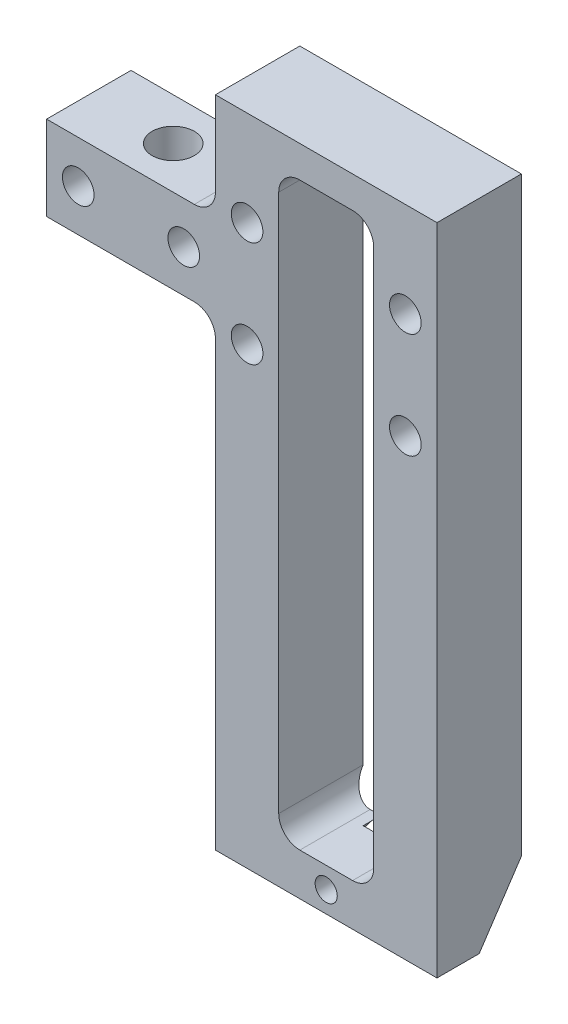
ISO-10303-21;
HEADER;
FILE_DESCRIPTION(('STEP AP214'),'2;1');
FILE_NAME('part.step','',(''),(''),'','','');
FILE_SCHEMA(('AUTOMOTIVE_DESIGN { 1 0 10303 214 1 1 1 1 }'));
ENDSEC;
DATA;
#1=APPLICATION_CONTEXT('core data for automotive mechanical design processes');
#2=APPLICATION_PROTOCOL_DEFINITION('international standard','automotive_design',2000,#1);
#3=PRODUCT_CONTEXT('',#1,'mechanical');
#4=PRODUCT('Part','Part','',(#3));
#5=PRODUCT_RELATED_PRODUCT_CATEGORY('part','',(#4));
#6=PRODUCT_DEFINITION_FORMATION('','',#4);
#7=PRODUCT_DEFINITION_CONTEXT('part definition',#1,'design');
#8=PRODUCT_DEFINITION('design','',#6,#7);
#9=PRODUCT_DEFINITION_SHAPE('','',#8);
#10=(LENGTH_UNIT() NAMED_UNIT(*) SI_UNIT(.MILLI.,.METRE.));
#11=(NAMED_UNIT(*) PLANE_ANGLE_UNIT() SI_UNIT($,.RADIAN.));
#12=(NAMED_UNIT(*) SI_UNIT($,.STERADIAN.) SOLID_ANGLE_UNIT());
#13=UNCERTAINTY_MEASURE_WITH_UNIT(LENGTH_MEASURE(1.E-05),#10,'distance_accuracy_value','');
#14=(GEOMETRIC_REPRESENTATION_CONTEXT(3) GLOBAL_UNCERTAINTY_ASSIGNED_CONTEXT((#13)) GLOBAL_UNIT_ASSIGNED_CONTEXT((#10,
#11,#12)) REPRESENTATION_CONTEXT('',''));
#15=CARTESIAN_POINT('',(0.,0.,0.));
#16=DIRECTION('',(0.,0.,1.));
#17=DIRECTION('',(1.,0.,0.));
#18=AXIS2_PLACEMENT_3D('',#15,#16,#17);
#19=CARTESIAN_POINT('',(26.5,2.,0.));
#20=DIRECTION('',(0.,0.,1.));
#21=DIRECTION('',(1.,0.,0.));
#22=AXIS2_PLACEMENT_3D('',#19,#20,#21);
#23=CYLINDRICAL_SURFACE('',#22,1.05);
#24=CARTESIAN_POINT('',(26.5,2.,8.));
#25=DIRECTION('',(0.,0.,1.));
#26=DIRECTION('',(1.,0.,0.));
#27=AXIS2_PLACEMENT_3D('',#24,#25,#26);
#28=CIRCLE('',#27,1.05);
#29=CARTESIAN_POINT('',(27.55,2.,8.));
#30=VERTEX_POINT('',#29);
#31=EDGE_CURVE('E333',#30,#30,#28,.T.);
#32=ORIENTED_EDGE('',*,*,#31,.T.);
#33=EDGE_LOOP('',(#32));
#34=FACE_BOUND('',#33,.T.);
#35=CARTESIAN_POINT('',(26.5,2.,3.));
#36=DIRECTION('',(0.,0.,-1.));
#37=DIRECTION('',(-1.,0.,0.));
#38=AXIS2_PLACEMENT_3D('',#35,#36,#37);
#39=CIRCLE('',#38,1.05);
#40=CARTESIAN_POINT('',(27.423309265631,1.49999999999999,3.));
#41=VERTEX_POINT('',#40);
#42=CARTESIAN_POINT('',(25.576690734369,1.49999999999999,3.));
#43=VERTEX_POINT('',#42);
#44=EDGE_CURVE('E304',#41,#43,#39,.F.);
#45=ORIENTED_EDGE('',*,*,#44,.F.);
#46=CARTESIAN_POINT('',(26.5,2.,2.66666666666666));
#47=DIRECTION('',(0.,0.554700196225229,0.832050294337844));
#48=DIRECTION('',(0.,-0.832050294337844,0.554700196225229));
#49=AXIS2_PLACEMENT_3D('',#46,#47,#48);
#50=ELLIPSE('',#49,1.26194294641239,1.05);
#51=EDGE_CURVE('E48',#41,#43,#50,.F.);
#52=ORIENTED_EDGE('',*,*,#51,.T.);
#53=EDGE_LOOP('',(#45,#52));
#54=FACE_BOUND('',#53,.T.);
#55=ADVANCED_FACE('F34',(#34,#54),#23,.F.);
#56=CARTESIAN_POINT('',(0.,0.,8.));
#57=DIRECTION('',(0.,0.,-1.));
#58=DIRECTION('',(-1.,0.,0.));
#59=AXIS2_PLACEMENT_3D('',#56,#57,#58);
#60=PLANE('',#59);
#61=ORIENTED_EDGE('',*,*,#31,.F.);
#62=EDGE_LOOP('',(#61));
#63=FACE_BOUND('',#62,.T.);
#64=DIRECTION('',(-1.,0.,0.));
#65=VECTOR('',#64,1.);
#66=CARTESIAN_POINT('',(22.,59.,8.));
#67=LINE('',#66,#65);
#68=CARTESIAN_POINT('',(29.,59.,8.));
#69=VERTEX_POINT('',#68);
#70=CARTESIAN_POINT('',(24.,59.,8.));
#71=VERTEX_POINT('',#70);
#72=EDGE_CURVE('E350',#69,#71,#67,.T.);
#73=ORIENTED_EDGE('',*,*,#72,.F.);
#74=CARTESIAN_POINT('',(29.,57.,8.));
#75=DIRECTION('',(0.,0.,-1.));
#76=DIRECTION('',(-1.,0.,0.));
#77=AXIS2_PLACEMENT_3D('',#74,#75,#76);
#78=CIRCLE('',#77,2.);
#79=CARTESIAN_POINT('',(31.,57.,8.));
#80=VERTEX_POINT('',#79);
#81=EDGE_CURVE('E290',#69,#80,#78,.T.);
#82=ORIENTED_EDGE('',*,*,#81,.T.);
#83=DIRECTION('',(0.,1.,0.));
#84=VECTOR('',#83,1.);
#85=CARTESIAN_POINT('',(31.,4.,8.));
#86=LINE('',#85,#84);
#87=CARTESIAN_POINT('',(31.,6.,8.));
#88=VERTEX_POINT('',#87);
#89=EDGE_CURVE('E302',#88,#80,#86,.T.);
#90=ORIENTED_EDGE('',*,*,#89,.F.);
#91=CARTESIAN_POINT('',(29.,6.,8.));
#92=DIRECTION('',(0.,0.,-1.));
#93=DIRECTION('',(-1.,0.,0.));
#94=AXIS2_PLACEMENT_3D('',#91,#92,#93);
#95=CIRCLE('',#94,2.);
#96=CARTESIAN_POINT('',(29.,4.,8.));
#97=VERTEX_POINT('',#96);
#98=EDGE_CURVE('E286',#88,#97,#95,.T.);
#99=ORIENTED_EDGE('',*,*,#98,.T.);
#100=DIRECTION('',(1.,0.,0.));
#101=VECTOR('',#100,1.);
#102=CARTESIAN_POINT('',(22.,4.,8.));
#103=LINE('',#102,#101);
#104=CARTESIAN_POINT('',(24.,4.,8.));
#105=VERTEX_POINT('',#104);
#106=EDGE_CURVE('E341',#105,#97,#103,.T.);
#107=ORIENTED_EDGE('',*,*,#106,.F.);
#108=CARTESIAN_POINT('',(24.,6.,8.));
#109=DIRECTION('',(0.,0.,-1.));
#110=DIRECTION('',(-1.,0.,0.));
#111=AXIS2_PLACEMENT_3D('',#108,#109,#110);
#112=CIRCLE('',#111,2.);
#113=CARTESIAN_POINT('',(22.,6.,8.));
#114=VERTEX_POINT('',#113);
#115=EDGE_CURVE('E288',#105,#114,#112,.T.);
#116=ORIENTED_EDGE('',*,*,#115,.T.);
#117=DIRECTION('',(0.,-1.,0.));
#118=VECTOR('',#117,1.);
#119=CARTESIAN_POINT('',(22.,4.,8.));
#120=LINE('',#119,#118);
#121=CARTESIAN_POINT('',(22.,57.,8.));
#122=VERTEX_POINT('',#121);
#123=EDGE_CURVE('E353',#122,#114,#120,.T.);
#124=ORIENTED_EDGE('',*,*,#123,.F.);
#125=CARTESIAN_POINT('',(24.,57.,8.));
#126=DIRECTION('',(0.,0.,-1.));
#127=DIRECTION('',(-1.,0.,0.));
#128=AXIS2_PLACEMENT_3D('',#125,#126,#127);
#129=CIRCLE('',#128,2.);
#130=EDGE_CURVE('E294',#122,#71,#129,.T.);
#131=ORIENTED_EDGE('',*,*,#130,.T.);
#132=EDGE_LOOP('',(#73,#82,#90,#99,#107,#116,#124,#131));
#133=FACE_BOUND('',#132,.T.);
#134=DIRECTION('',(0.,-1.,0.));
#135=VECTOR('',#134,1.);
#136=CARTESIAN_POINT('',(0.,52.,8.));
#137=LINE('',#136,#135);
#138=CARTESIAN_POINT('',(0.,52.,8.));
#139=VERTEX_POINT('',#138);
#140=CARTESIAN_POINT('',(0.,44.,8.));
#141=VERTEX_POINT('',#140);
#142=EDGE_CURVE('E230',#139,#141,#137,.T.);
#143=ORIENTED_EDGE('',*,*,#142,.T.);
#144=DIRECTION('',(1.,0.,0.));
#145=VECTOR('',#144,1.);
#146=CARTESIAN_POINT('',(16.,44.,8.));
#147=LINE('',#146,#145);
#148=CARTESIAN_POINT('',(14.,44.,8.));
#149=VERTEX_POINT('',#148);
#150=EDGE_CURVE('E396',#141,#149,#147,.T.);
#151=ORIENTED_EDGE('',*,*,#150,.T.);
#152=CARTESIAN_POINT('',(14.,42.,8.));
#153=DIRECTION('',(0.,0.,-1.));
#154=DIRECTION('',(-1.,0.,0.));
#155=AXIS2_PLACEMENT_3D('',#152,#153,#154);
#156=CIRCLE('',#155,2.);
#157=CARTESIAN_POINT('',(16.,42.,8.));
#158=VERTEX_POINT('',#157);
#159=EDGE_CURVE('E259',#149,#158,#156,.T.);
#160=ORIENTED_EDGE('',*,*,#159,.T.);
#161=DIRECTION('',(0.,-1.,0.));
#162=VECTOR('',#161,1.);
#163=CARTESIAN_POINT('',(16.,0.,8.));
#164=LINE('',#163,#162);
#165=CARTESIAN_POINT('',(16.,0.,8.));
#166=VERTEX_POINT('',#165);
#167=EDGE_CURVE('E399',#158,#166,#164,.T.);
#168=ORIENTED_EDGE('',*,*,#167,.T.);
#169=DIRECTION('',(1.,0.,0.));
#170=VECTOR('',#169,1.);
#171=CARTESIAN_POINT('',(37.,0.,8.));
#172=LINE('',#171,#170);
#173=CARTESIAN_POINT('',(37.,0.,8.));
#174=VERTEX_POINT('',#173);
#175=EDGE_CURVE('E401',#166,#174,#172,.T.);
#176=ORIENTED_EDGE('',*,*,#175,.T.);
#177=DIRECTION('',(0.,1.,0.));
#178=VECTOR('',#177,1.);
#179=CARTESIAN_POINT('',(37.,62.,8.));
#180=LINE('',#179,#178);
#181=CARTESIAN_POINT('',(37.,62.,8.));
#182=VERTEX_POINT('',#181);
#183=EDGE_CURVE('E403',#174,#182,#180,.T.);
#184=ORIENTED_EDGE('',*,*,#183,.T.);
#185=DIRECTION('',(-1.,0.,0.));
#186=VECTOR('',#185,1.);
#187=CARTESIAN_POINT('',(16.,62.,8.));
#188=LINE('',#187,#186);
#189=CARTESIAN_POINT('',(16.,62.,8.));
#190=VERTEX_POINT('',#189);
#191=EDGE_CURVE('E405',#182,#190,#188,.T.);
#192=ORIENTED_EDGE('',*,*,#191,.T.);
#193=DIRECTION('',(0.,-1.,0.));
#194=VECTOR('',#193,1.);
#195=CARTESIAN_POINT('',(16.,52.,8.));
#196=LINE('',#195,#194);
#197=CARTESIAN_POINT('',(16.,54.,8.));
#198=VERTEX_POINT('',#197);
#199=EDGE_CURVE('E407',#190,#198,#196,.T.);
#200=ORIENTED_EDGE('',*,*,#199,.T.);
#201=CARTESIAN_POINT('',(14.,54.,8.));
#202=DIRECTION('',(0.,0.,-1.));
#203=DIRECTION('',(-1.,0.,0.));
#204=AXIS2_PLACEMENT_3D('',#201,#202,#203);
#205=CIRCLE('',#204,2.);
#206=CARTESIAN_POINT('',(14.,52.,8.));
#207=VERTEX_POINT('',#206);
#208=EDGE_CURVE('E263',#198,#207,#205,.T.);
#209=ORIENTED_EDGE('',*,*,#208,.T.);
#210=DIRECTION('',(-1.,0.,0.));
#211=VECTOR('',#210,1.);
#212=CARTESIAN_POINT('',(0.,52.,8.));
#213=LINE('',#212,#211);
#214=EDGE_CURVE('E235',#207,#139,#213,.T.);
#215=ORIENTED_EDGE('',*,*,#214,.T.);
#216=EDGE_LOOP('',(#143,#151,#160,#168,#176,#184,#192,#200,#209,#215));
#217=FACE_BOUND('',#216,.T.);
#218=CARTESIAN_POINT('',(19.,53.,8.));
#219=DIRECTION('',(0.,0.,1.));
#220=DIRECTION('',(1.,0.,0.));
#221=AXIS2_PLACEMENT_3D('',#218,#219,#220);
#222=CIRCLE('',#221,1.5);
#223=CARTESIAN_POINT('',(20.5,53.,8.));
#224=VERTEX_POINT('',#223);
#225=EDGE_CURVE('E388',#224,#224,#222,.T.);
#226=ORIENTED_EDGE('',*,*,#225,.F.);
#227=EDGE_LOOP('',(#226));
#228=FACE_BOUND('',#227,.T.);
#229=CARTESIAN_POINT('',(34.,53.,8.));
#230=DIRECTION('',(0.,0.,1.));
#231=DIRECTION('',(1.,0.,0.));
#232=AXIS2_PLACEMENT_3D('',#229,#230,#231);
#233=CIRCLE('',#232,1.5);
#234=CARTESIAN_POINT('',(35.5,53.,8.));
#235=VERTEX_POINT('',#234);
#236=EDGE_CURVE('E382',#235,#235,#233,.T.);
#237=ORIENTED_EDGE('',*,*,#236,.F.);
#238=EDGE_LOOP('',(#237));
#239=FACE_BOUND('',#238,.T.);
#240=CARTESIAN_POINT('',(19.,43.,8.));
#241=DIRECTION('',(0.,0.,1.));
#242=DIRECTION('',(1.,0.,0.));
#243=AXIS2_PLACEMENT_3D('',#240,#241,#242);
#244=CIRCLE('',#243,1.5);
#245=CARTESIAN_POINT('',(20.5,43.,8.));
#246=VERTEX_POINT('',#245);
#247=EDGE_CURVE('E376',#246,#246,#244,.T.);
#248=ORIENTED_EDGE('',*,*,#247,.F.);
#249=EDGE_LOOP('',(#248));
#250=FACE_BOUND('',#249,.T.);
#251=CARTESIAN_POINT('',(34.,43.,8.));
#252=DIRECTION('',(0.,0.,1.));
#253=DIRECTION('',(1.,0.,0.));
#254=AXIS2_PLACEMENT_3D('',#251,#252,#253);
#255=CIRCLE('',#254,1.5);
#256=CARTESIAN_POINT('',(35.5,43.,8.));
#257=VERTEX_POINT('',#256);
#258=EDGE_CURVE('E370',#257,#257,#255,.T.);
#259=ORIENTED_EDGE('',*,*,#258,.F.);
#260=EDGE_LOOP('',(#259));
#261=FACE_BOUND('',#260,.T.);
#262=CARTESIAN_POINT('',(13.,48.,8.));
#263=DIRECTION('',(0.,0.,1.));
#264=DIRECTION('',(1.,0.,0.));
#265=AXIS2_PLACEMENT_3D('',#262,#263,#264);
#266=CIRCLE('',#265,1.5);
#267=CARTESIAN_POINT('',(14.5,48.,8.));
#268=VERTEX_POINT('',#267);
#269=EDGE_CURVE('E364',#268,#268,#266,.T.);
#270=ORIENTED_EDGE('',*,*,#269,.F.);
#271=EDGE_LOOP('',(#270));
#272=FACE_BOUND('',#271,.T.);
#273=CARTESIAN_POINT('',(3.,48.,8.));
#274=DIRECTION('',(0.,0.,1.));
#275=DIRECTION('',(1.,0.,0.));
#276=AXIS2_PLACEMENT_3D('',#273,#274,#275);
#277=CIRCLE('',#276,1.5);
#278=CARTESIAN_POINT('',(4.5,48.,8.));
#279=VERTEX_POINT('',#278);
#280=EDGE_CURVE('E358',#279,#279,#277,.T.);
#281=ORIENTED_EDGE('',*,*,#280,.F.);
#282=EDGE_LOOP('',(#281));
#283=FACE_BOUND('',#282,.T.);
#284=ADVANCED_FACE('F424',(#63,#133,#217,#228,#239,#250,#261,#272,#283),#60,.F.);
#285=CARTESIAN_POINT('',(0.,0.,0.));
#286=DIRECTION('',(0.,0.,-1.));
#287=DIRECTION('',(-1.,0.,0.));
#288=AXIS2_PLACEMENT_3D('',#285,#286,#287);
#289=PLANE('',#288);
#290=DIRECTION('',(1.,0.,0.));
#291=VECTOR('',#290,1.);
#292=CARTESIAN_POINT('',(15.,5.99999999999999,0.));
#293=LINE('',#292,#291);
#294=CARTESIAN_POINT('',(16.,5.99999999999999,0.));
#295=VERTEX_POINT('',#294);
#296=CARTESIAN_POINT('',(22.,6.,0.));
#297=VERTEX_POINT('',#296);
#298=EDGE_CURVE('E199',#295,#297,#293,.T.);
#299=ORIENTED_EDGE('',*,*,#298,.F.);
#300=DIRECTION('',(0.,-1.,0.));
#301=VECTOR('',#300,1.);
#302=CARTESIAN_POINT('',(16.,0.,0.));
#303=LINE('',#302,#301);
#304=CARTESIAN_POINT('',(16.,42.,0.));
#305=VERTEX_POINT('',#304);
#306=EDGE_CURVE('E217',#305,#295,#303,.T.);
#307=ORIENTED_EDGE('',*,*,#306,.F.);
#308=CARTESIAN_POINT('',(14.,42.,0.));
#309=DIRECTION('',(0.,0.,-1.));
#310=DIRECTION('',(-1.,0.,0.));
#311=AXIS2_PLACEMENT_3D('',#308,#309,#310);
#312=CIRCLE('',#311,2.);
#313=CARTESIAN_POINT('',(14.,44.,0.));
#314=VERTEX_POINT('',#313);
#315=EDGE_CURVE('E257',#305,#314,#312,.F.);
#316=ORIENTED_EDGE('',*,*,#315,.T.);
#317=DIRECTION('',(1.,0.,0.));
#318=VECTOR('',#317,1.);
#319=CARTESIAN_POINT('',(16.,44.,0.));
#320=LINE('',#319,#318);
#321=CARTESIAN_POINT('',(0.,44.,0.));
#322=VERTEX_POINT('',#321);
#323=EDGE_CURVE('E222',#322,#314,#320,.T.);
#324=ORIENTED_EDGE('',*,*,#323,.F.);
#325=DIRECTION('',(0.,-1.,0.));
#326=VECTOR('',#325,1.);
#327=CARTESIAN_POINT('',(0.,52.,0.));
#328=LINE('',#327,#326);
#329=CARTESIAN_POINT('',(0.,52.,0.));
#330=VERTEX_POINT('',#329);
#331=EDGE_CURVE('E391',#330,#322,#328,.T.);
#332=ORIENTED_EDGE('',*,*,#331,.F.);
#333=DIRECTION('',(-1.,0.,0.));
#334=VECTOR('',#333,1.);
#335=CARTESIAN_POINT('',(0.,52.,0.));
#336=LINE('',#335,#334);
#337=CARTESIAN_POINT('',(14.,52.,0.));
#338=VERTEX_POINT('',#337);
#339=EDGE_CURVE('E228',#338,#330,#336,.T.);
#340=ORIENTED_EDGE('',*,*,#339,.F.);
#341=CARTESIAN_POINT('',(14.,54.,0.));
#342=DIRECTION('',(0.,0.,-1.));
#343=DIRECTION('',(-1.,0.,0.));
#344=AXIS2_PLACEMENT_3D('',#341,#342,#343);
#345=CIRCLE('',#344,2.);
#346=CARTESIAN_POINT('',(16.,54.,0.));
#347=VERTEX_POINT('',#346);
#348=EDGE_CURVE('E261',#338,#347,#345,.F.);
#349=ORIENTED_EDGE('',*,*,#348,.T.);
#350=DIRECTION('',(0.,-1.,0.));
#351=VECTOR('',#350,1.);
#352=CARTESIAN_POINT('',(16.,52.,0.));
#353=LINE('',#352,#351);
#354=CARTESIAN_POINT('',(16.,62.,0.));
#355=VERTEX_POINT('',#354);
#356=EDGE_CURVE('E219',#355,#347,#353,.T.);
#357=ORIENTED_EDGE('',*,*,#356,.F.);
#358=DIRECTION('',(-1.,0.,0.));
#359=VECTOR('',#358,1.);
#360=CARTESIAN_POINT('',(16.,62.,0.));
#361=LINE('',#360,#359);
#362=CARTESIAN_POINT('',(37.,62.,0.));
#363=VERTEX_POINT('',#362);
#364=EDGE_CURVE('E216',#363,#355,#361,.T.);
#365=ORIENTED_EDGE('',*,*,#364,.F.);
#366=DIRECTION('',(0.,1.,0.));
#367=VECTOR('',#366,1.);
#368=CARTESIAN_POINT('',(37.,62.,0.));
#369=LINE('',#368,#367);
#370=CARTESIAN_POINT('',(37.,6.,0.));
#371=VERTEX_POINT('',#370);
#372=EDGE_CURVE('E205',#371,#363,#369,.T.);
#373=ORIENTED_EDGE('',*,*,#372,.F.);
#374=CARTESIAN_POINT('',(31.,6.,0.));
#375=VERTEX_POINT('',#374);
#376=EDGE_CURVE('E188',#375,#371,#293,.T.);
#377=ORIENTED_EDGE('',*,*,#376,.F.);
#378=DIRECTION('',(0.,1.,0.));
#379=VECTOR('',#378,1.);
#380=CARTESIAN_POINT('',(31.,4.,0.));
#381=LINE('',#380,#379);
#382=CARTESIAN_POINT('',(31.,57.,0.));
#383=VERTEX_POINT('',#382);
#384=EDGE_CURVE('E338',#375,#383,#381,.T.);
#385=ORIENTED_EDGE('',*,*,#384,.T.);
#386=CARTESIAN_POINT('',(29.,57.,0.));
#387=DIRECTION('',(0.,0.,-1.));
#388=DIRECTION('',(-1.,0.,0.));
#389=AXIS2_PLACEMENT_3D('',#386,#387,#388);
#390=CIRCLE('',#389,2.);
#391=CARTESIAN_POINT('',(29.,59.,0.));
#392=VERTEX_POINT('',#391);
#393=EDGE_CURVE('E292',#383,#392,#390,.F.);
#394=ORIENTED_EDGE('',*,*,#393,.T.);
#395=DIRECTION('',(-1.,0.,0.));
#396=VECTOR('',#395,1.);
#397=CARTESIAN_POINT('',(22.,59.,0.));
#398=LINE('',#397,#396);
#399=CARTESIAN_POINT('',(24.,59.,0.));
#400=VERTEX_POINT('',#399);
#401=EDGE_CURVE('E340',#392,#400,#398,.T.);
#402=ORIENTED_EDGE('',*,*,#401,.T.);
#403=CARTESIAN_POINT('',(24.,57.,0.));
#404=DIRECTION('',(0.,0.,-1.));
#405=DIRECTION('',(-1.,0.,0.));
#406=AXIS2_PLACEMENT_3D('',#403,#404,#405);
#407=CIRCLE('',#406,2.);
#408=CARTESIAN_POINT('',(22.,57.,0.));
#409=VERTEX_POINT('',#408);
#410=EDGE_CURVE('E296',#400,#409,#407,.F.);
#411=ORIENTED_EDGE('',*,*,#410,.T.);
#412=DIRECTION('',(0.,-1.,0.));
#413=VECTOR('',#412,1.);
#414=CARTESIAN_POINT('',(22.,4.,0.));
#415=LINE('',#414,#413);
#416=EDGE_CURVE('E344',#409,#297,#415,.T.);
#417=ORIENTED_EDGE('',*,*,#416,.T.);
#418=EDGE_LOOP('',(#299,#307,#316,#324,#332,#340,#349,#357,#365,#373,#377,#385,#394,#402,#411,#417));
#419=FACE_BOUND('',#418,.T.);
#420=CARTESIAN_POINT('',(13.,48.,0.));
#421=DIRECTION('',(0.,0.,1.));
#422=DIRECTION('',(1.,0.,0.));
#423=AXIS2_PLACEMENT_3D('',#420,#421,#422);
#424=CIRCLE('',#423,1.5);
#425=CARTESIAN_POINT('',(14.5,48.,0.));
#426=VERTEX_POINT('',#425);
#427=EDGE_CURVE('E361',#426,#426,#424,.T.);
#428=ORIENTED_EDGE('',*,*,#427,.T.);
#429=EDGE_LOOP('',(#428));
#430=FACE_BOUND('',#429,.T.);
#431=CARTESIAN_POINT('',(19.,43.,0.));
#432=DIRECTION('',(0.,0.,1.));
#433=DIRECTION('',(1.,0.,0.));
#434=AXIS2_PLACEMENT_3D('',#431,#432,#433);
#435=CIRCLE('',#434,1.5);
#436=CARTESIAN_POINT('',(20.5,43.,0.));
#437=VERTEX_POINT('',#436);
#438=EDGE_CURVE('E373',#437,#437,#435,.T.);
#439=ORIENTED_EDGE('',*,*,#438,.T.);
#440=EDGE_LOOP('',(#439));
#441=FACE_BOUND('',#440,.T.);
#442=CARTESIAN_POINT('',(19.,53.,0.));
#443=DIRECTION('',(0.,0.,1.));
#444=DIRECTION('',(1.,0.,0.));
#445=AXIS2_PLACEMENT_3D('',#442,#443,#444);
#446=CIRCLE('',#445,1.5);
#447=CARTESIAN_POINT('',(20.5,53.,0.));
#448=VERTEX_POINT('',#447);
#449=EDGE_CURVE('E385',#448,#448,#446,.T.);
#450=ORIENTED_EDGE('',*,*,#449,.T.);
#451=EDGE_LOOP('',(#450));
#452=FACE_BOUND('',#451,.T.);
#453=CARTESIAN_POINT('',(34.,53.,0.));
#454=DIRECTION('',(0.,0.,1.));
#455=DIRECTION('',(1.,0.,0.));
#456=AXIS2_PLACEMENT_3D('',#453,#454,#455);
#457=CIRCLE('',#456,1.5);
#458=CARTESIAN_POINT('',(35.5,53.,0.));
#459=VERTEX_POINT('',#458);
#460=EDGE_CURVE('E379',#459,#459,#457,.T.);
#461=ORIENTED_EDGE('',*,*,#460,.T.);
#462=EDGE_LOOP('',(#461));
#463=FACE_BOUND('',#462,.T.);
#464=CARTESIAN_POINT('',(34.,43.,0.));
#465=DIRECTION('',(0.,0.,1.));
#466=DIRECTION('',(1.,0.,0.));
#467=AXIS2_PLACEMENT_3D('',#464,#465,#466);
#468=CIRCLE('',#467,1.5);
#469=CARTESIAN_POINT('',(35.5,43.,0.));
#470=VERTEX_POINT('',#469);
#471=EDGE_CURVE('E367',#470,#470,#468,.T.);
#472=ORIENTED_EDGE('',*,*,#471,.T.);
#473=EDGE_LOOP('',(#472));
#474=FACE_BOUND('',#473,.T.);
#475=CARTESIAN_POINT('',(3.,48.,0.));
#476=DIRECTION('',(0.,0.,1.));
#477=DIRECTION('',(1.,0.,0.));
#478=AXIS2_PLACEMENT_3D('',#475,#476,#477);
#479=CIRCLE('',#478,1.5);
#480=CARTESIAN_POINT('',(4.5,48.,0.));
#481=VERTEX_POINT('',#480);
#482=EDGE_CURVE('E347',#481,#481,#479,.T.);
#483=ORIENTED_EDGE('',*,*,#482,.T.);
#484=EDGE_LOOP('',(#483));
#485=FACE_BOUND('',#484,.T.);
#486=ADVANCED_FACE('F213',(#419,#430,#441,#452,#463,#474,#485),#289,.T.);
#487=CARTESIAN_POINT('',(0.,52.,8.));
#488=DIRECTION('',(1.,0.,0.));
#489=DIRECTION('',(0.,1.,0.));
#490=AXIS2_PLACEMENT_3D('',#487,#488,#489);
#491=PLANE('',#490);
#492=ORIENTED_EDGE('',*,*,#331,.T.);
#493=DIRECTION('',(0.,0.,-1.));
#494=VECTOR('',#493,1.);
#495=CARTESIAN_POINT('',(0.,44.,8.));
#496=LINE('',#495,#494);
#497=EDGE_CURVE('E244',#141,#322,#496,.T.);
#498=ORIENTED_EDGE('',*,*,#497,.F.);
#499=ORIENTED_EDGE('',*,*,#142,.F.);
#500=DIRECTION('',(0.,0.,-1.));
#501=VECTOR('',#500,1.);
#502=CARTESIAN_POINT('',(0.,52.,8.));
#503=LINE('',#502,#501);
#504=EDGE_CURVE('E231',#139,#330,#503,.T.);
#505=ORIENTED_EDGE('',*,*,#504,.T.);
#506=EDGE_LOOP('',(#492,#498,#499,#505));
#507=FACE_BOUND('',#506,.T.);
#508=ADVANCED_FACE('F452',(#507),#491,.F.);
#509=CARTESIAN_POINT('',(16.,44.,8.));
#510=DIRECTION('',(0.,1.,0.));
#511=DIRECTION('',(0.,0.,1.));
#512=AXIS2_PLACEMENT_3D('',#509,#510,#511);
#513=PLANE('',#512);
#514=CARTESIAN_POINT('',(8.,44.,4.));
#515=DIRECTION('',(0.,-1.,0.));
#516=DIRECTION('',(0.,0.,-1.));
#517=AXIS2_PLACEMENT_3D('',#514,#515,#516);
#518=CIRCLE('',#517,2.);
#519=CARTESIAN_POINT('',(8.,44.,2.));
#520=VERTEX_POINT('',#519);
#521=EDGE_CURVE('E303',#520,#520,#518,.T.);
#522=ORIENTED_EDGE('',*,*,#521,.F.);
#523=EDGE_LOOP('',(#522));
#524=FACE_BOUND('',#523,.T.);
#525=ORIENTED_EDGE('',*,*,#323,.T.);
#526=DIRECTION('',(0.,0.,-1.));
#527=VECTOR('',#526,1.);
#528=CARTESIAN_POINT('',(14.,44.,8.));
#529=LINE('',#528,#527);
#530=EDGE_CURVE('E250',#314,#149,#529,.F.);
#531=ORIENTED_EDGE('',*,*,#530,.T.);
#532=ORIENTED_EDGE('',*,*,#150,.F.);
#533=ORIENTED_EDGE('',*,*,#497,.T.);
#534=EDGE_LOOP('',(#525,#531,#532,#533));
#535=FACE_BOUND('',#534,.T.);
#536=ADVANCED_FACE('F415',(#524,#535),#513,.F.);
#537=CARTESIAN_POINT('',(16.,0.,8.));
#538=DIRECTION('',(1.,0.,0.));
#539=DIRECTION('',(0.,1.,0.));
#540=AXIS2_PLACEMENT_3D('',#537,#538,#539);
#541=PLANE('',#540);
#542=ORIENTED_EDGE('',*,*,#306,.T.);
#543=DIRECTION('',(0.,-0.832050294337844,0.554700196225229));
#544=VECTOR('',#543,1.);
#545=CARTESIAN_POINT('',(16.,-1.84615384615385,5.23076923076922));
#546=LINE('',#545,#544);
#547=CARTESIAN_POINT('',(16.,0.,4.));
#548=VERTEX_POINT('',#547);
#549=EDGE_CURVE('E328',#295,#548,#546,.T.);
#550=ORIENTED_EDGE('',*,*,#549,.T.);
#551=DIRECTION('',(0.,0.,-1.));
#552=VECTOR('',#551,1.);
#553=CARTESIAN_POINT('',(16.,0.,8.));
#554=LINE('',#553,#552);
#555=EDGE_CURVE('E241',#166,#548,#554,.T.);
#556=ORIENTED_EDGE('',*,*,#555,.F.);
#557=ORIENTED_EDGE('',*,*,#167,.F.);
#558=DIRECTION('',(0.,0.,-1.));
#559=VECTOR('',#558,1.);
#560=CARTESIAN_POINT('',(16.,42.,0.));
#561=LINE('',#560,#559);
#562=EDGE_CURVE('E247',#158,#305,#561,.T.);
#563=ORIENTED_EDGE('',*,*,#562,.T.);
#564=EDGE_LOOP('',(#542,#550,#556,#557,#563));
#565=FACE_BOUND('',#564,.T.);
#566=ADVANCED_FACE('F428',(#565),#541,.F.);
#567=CARTESIAN_POINT('',(37.,0.,8.));
#568=DIRECTION('',(0.,1.,0.));
#569=DIRECTION('',(-1.,0.,0.));
#570=AXIS2_PLACEMENT_3D('',#567,#568,#569);
#571=PLANE('',#570);
#572=ORIENTED_EDGE('',*,*,#555,.T.);
#573=DIRECTION('',(1.,0.,0.));
#574=VECTOR('',#573,1.);
#575=CARTESIAN_POINT('',(15.,0.,4.));
#576=LINE('',#575,#574);
#577=CARTESIAN_POINT('',(37.,0.,4.));
#578=VERTEX_POINT('',#577);
#579=EDGE_CURVE('E324',#548,#578,#576,.T.);
#580=ORIENTED_EDGE('',*,*,#579,.T.);
#581=DIRECTION('',(0.,0.,-1.));
#582=VECTOR('',#581,1.);
#583=CARTESIAN_POINT('',(37.,0.,8.));
#584=LINE('',#583,#582);
#585=EDGE_CURVE('E209',#174,#578,#584,.T.);
#586=ORIENTED_EDGE('',*,*,#585,.F.);
#587=ORIENTED_EDGE('',*,*,#175,.F.);
#588=EDGE_LOOP('',(#572,#580,#586,#587));
#589=FACE_BOUND('',#588,.T.);
#590=ADVANCED_FACE('F433',(#589),#571,.F.);
#591=CARTESIAN_POINT('',(37.,62.,8.));
#592=DIRECTION('',(-1.,0.,0.));
#593=DIRECTION('',(0.,-1.,0.));
#594=AXIS2_PLACEMENT_3D('',#591,#592,#593);
#595=PLANE('',#594);
#596=ORIENTED_EDGE('',*,*,#585,.T.);
#597=DIRECTION('',(0.,-0.832050294337844,0.554700196225229));
#598=VECTOR('',#597,1.);
#599=CARTESIAN_POINT('',(37.,0.,4.));
#600=LINE('',#599,#598);
#601=EDGE_CURVE('E191',#371,#578,#600,.T.);
#602=ORIENTED_EDGE('',*,*,#601,.F.);
#603=ORIENTED_EDGE('',*,*,#372,.T.);
#604=DIRECTION('',(0.,0.,-1.));
#605=VECTOR('',#604,1.);
#606=CARTESIAN_POINT('',(37.,62.,8.));
#607=LINE('',#606,#605);
#608=EDGE_CURVE('E238',#182,#363,#607,.T.);
#609=ORIENTED_EDGE('',*,*,#608,.F.);
#610=ORIENTED_EDGE('',*,*,#183,.F.);
#611=EDGE_LOOP('',(#596,#602,#603,#609,#610));
#612=FACE_BOUND('',#611,.T.);
#613=ADVANCED_FACE('F203',(#612),#595,.F.);
#614=CARTESIAN_POINT('',(16.,62.,8.));
#615=DIRECTION('',(0.,-1.,0.));
#616=DIRECTION('',(1.,0.,0.));
#617=AXIS2_PLACEMENT_3D('',#614,#615,#616);
#618=PLANE('',#617);
#619=ORIENTED_EDGE('',*,*,#364,.T.);
#620=DIRECTION('',(0.,0.,-1.));
#621=VECTOR('',#620,1.);
#622=CARTESIAN_POINT('',(16.,62.,8.));
#623=LINE('',#622,#621);
#624=EDGE_CURVE('E234',#190,#355,#623,.T.);
#625=ORIENTED_EDGE('',*,*,#624,.F.);
#626=ORIENTED_EDGE('',*,*,#191,.F.);
#627=ORIENTED_EDGE('',*,*,#608,.T.);
#628=EDGE_LOOP('',(#619,#625,#626,#627));
#629=FACE_BOUND('',#628,.T.);
#630=ADVANCED_FACE('F437',(#629),#618,.F.);
#631=CARTESIAN_POINT('',(16.,52.,8.));
#632=DIRECTION('',(1.,0.,0.));
#633=DIRECTION('',(0.,0.,-1.));
#634=AXIS2_PLACEMENT_3D('',#631,#632,#633);
#635=PLANE('',#634);
#636=ORIENTED_EDGE('',*,*,#356,.T.);
#637=DIRECTION('',(0.,0.,-1.));
#638=VECTOR('',#637,1.);
#639=CARTESIAN_POINT('',(16.,54.,8.));
#640=LINE('',#639,#638);
#641=EDGE_CURVE('E255',#347,#198,#640,.F.);
#642=ORIENTED_EDGE('',*,*,#641,.T.);
#643=ORIENTED_EDGE('',*,*,#199,.F.);
#644=ORIENTED_EDGE('',*,*,#624,.T.);
#645=EDGE_LOOP('',(#636,#642,#643,#644));
#646=FACE_BOUND('',#645,.T.);
#647=ADVANCED_FACE('F440',(#646),#635,.F.);
#648=CARTESIAN_POINT('',(0.,52.,8.));
#649=DIRECTION('',(0.,-1.,0.));
#650=DIRECTION('',(0.,0.,-1.));
#651=AXIS2_PLACEMENT_3D('',#648,#649,#650);
#652=PLANE('',#651);
#653=CARTESIAN_POINT('',(8.,52.,4.));
#654=DIRECTION('',(0.,-1.,0.));
#655=DIRECTION('',(0.,0.,-1.));
#656=AXIS2_PLACEMENT_3D('',#653,#654,#655);
#657=CIRCLE('',#656,2.);
#658=CARTESIAN_POINT('',(8.,52.,2.));
#659=VERTEX_POINT('',#658);
#660=EDGE_CURVE('E299',#659,#659,#657,.T.);
#661=ORIENTED_EDGE('',*,*,#660,.T.);
#662=EDGE_LOOP('',(#661));
#663=FACE_BOUND('',#662,.T.);
#664=ORIENTED_EDGE('',*,*,#214,.F.);
#665=DIRECTION('',(0.,0.,-1.));
#666=VECTOR('',#665,1.);
#667=CARTESIAN_POINT('',(14.,52.,0.));
#668=LINE('',#667,#666);
#669=EDGE_CURVE('E252',#207,#338,#668,.T.);
#670=ORIENTED_EDGE('',*,*,#669,.T.);
#671=ORIENTED_EDGE('',*,*,#339,.T.);
#672=ORIENTED_EDGE('',*,*,#504,.F.);
#673=EDGE_LOOP('',(#664,#670,#671,#672));
#674=FACE_BOUND('',#673,.T.);
#675=ADVANCED_FACE('F449',(#663,#674),#652,.F.);
#676=CARTESIAN_POINT('',(19.,53.,8.));
#677=DIRECTION('',(0.,0.,-1.));
#678=DIRECTION('',(-1.,0.,0.));
#679=AXIS2_PLACEMENT_3D('',#676,#677,#678);
#680=CYLINDRICAL_SURFACE('',#679,1.5);
#681=ORIENTED_EDGE('',*,*,#225,.T.);
#682=EDGE_LOOP('',(#681));
#683=FACE_BOUND('',#682,.T.);
#684=ORIENTED_EDGE('',*,*,#449,.F.);
#685=EDGE_LOOP('',(#684));
#686=FACE_BOUND('',#685,.T.);
#687=ADVANCED_FACE('F515',(#683,#686),#680,.F.);
#688=CARTESIAN_POINT('',(34.,53.,8.));
#689=DIRECTION('',(0.,0.,-1.));
#690=DIRECTION('',(-1.,0.,0.));
#691=AXIS2_PLACEMENT_3D('',#688,#689,#690);
#692=CYLINDRICAL_SURFACE('',#691,1.5);
#693=ORIENTED_EDGE('',*,*,#236,.T.);
#694=EDGE_LOOP('',(#693));
#695=FACE_BOUND('',#694,.T.);
#696=ORIENTED_EDGE('',*,*,#460,.F.);
#697=EDGE_LOOP('',(#696));
#698=FACE_BOUND('',#697,.T.);
#699=ADVANCED_FACE('F511',(#695,#698),#692,.F.);
#700=CARTESIAN_POINT('',(19.,43.,8.));
#701=DIRECTION('',(0.,0.,-1.));
#702=DIRECTION('',(-1.,0.,0.));
#703=AXIS2_PLACEMENT_3D('',#700,#701,#702);
#704=CYLINDRICAL_SURFACE('',#703,1.5);
#705=ORIENTED_EDGE('',*,*,#247,.T.);
#706=EDGE_LOOP('',(#705));
#707=FACE_BOUND('',#706,.T.);
#708=ORIENTED_EDGE('',*,*,#438,.F.);
#709=EDGE_LOOP('',(#708));
#710=FACE_BOUND('',#709,.T.);
#711=ADVANCED_FACE('F507',(#707,#710),#704,.F.);
#712=CARTESIAN_POINT('',(34.,43.,8.));
#713=DIRECTION('',(0.,0.,-1.));
#714=DIRECTION('',(-1.,0.,0.));
#715=AXIS2_PLACEMENT_3D('',#712,#713,#714);
#716=CYLINDRICAL_SURFACE('',#715,1.5);
#717=ORIENTED_EDGE('',*,*,#258,.T.);
#718=EDGE_LOOP('',(#717));
#719=FACE_BOUND('',#718,.T.);
#720=ORIENTED_EDGE('',*,*,#471,.F.);
#721=EDGE_LOOP('',(#720));
#722=FACE_BOUND('',#721,.T.);
#723=ADVANCED_FACE('F503',(#719,#722),#716,.F.);
#724=CARTESIAN_POINT('',(13.,48.,8.));
#725=DIRECTION('',(0.,0.,-1.));
#726=DIRECTION('',(-1.,0.,0.));
#727=AXIS2_PLACEMENT_3D('',#724,#725,#726);
#728=CYLINDRICAL_SURFACE('',#727,1.5);
#729=ORIENTED_EDGE('',*,*,#269,.T.);
#730=EDGE_LOOP('',(#729));
#731=FACE_BOUND('',#730,.T.);
#732=ORIENTED_EDGE('',*,*,#427,.F.);
#733=EDGE_LOOP('',(#732));
#734=FACE_BOUND('',#733,.T.);
#735=ADVANCED_FACE('F499',(#731,#734),#728,.F.);
#736=CARTESIAN_POINT('',(3.,48.,8.));
#737=DIRECTION('',(0.,0.,-1.));
#738=DIRECTION('',(-1.,0.,0.));
#739=AXIS2_PLACEMENT_3D('',#736,#737,#738);
#740=CYLINDRICAL_SURFACE('',#739,1.5);
#741=ORIENTED_EDGE('',*,*,#280,.T.);
#742=EDGE_LOOP('',(#741));
#743=FACE_BOUND('',#742,.T.);
#744=ORIENTED_EDGE('',*,*,#482,.F.);
#745=EDGE_LOOP('',(#744));
#746=FACE_BOUND('',#745,.T.);
#747=ADVANCED_FACE('F496',(#743,#746),#740,.F.);
#748=CARTESIAN_POINT('',(14.,42.,8.));
#749=DIRECTION('',(0.,0.,1.));
#750=DIRECTION('',(1.,0.,0.));
#751=AXIS2_PLACEMENT_3D('',#748,#749,#750);
#752=CYLINDRICAL_SURFACE('',#751,2.);
#753=ORIENTED_EDGE('',*,*,#159,.F.);
#754=ORIENTED_EDGE('',*,*,#530,.F.);
#755=ORIENTED_EDGE('',*,*,#315,.F.);
#756=ORIENTED_EDGE('',*,*,#562,.F.);
#757=EDGE_LOOP('',(#753,#754,#755,#756));
#758=FACE_BOUND('',#757,.T.);
#759=ADVANCED_FACE('F420',(#758),#752,.F.);
#760=CARTESIAN_POINT('',(14.,54.,8.));
#761=DIRECTION('',(0.,0.,1.));
#762=DIRECTION('',(1.,0.,0.));
#763=AXIS2_PLACEMENT_3D('',#760,#761,#762);
#764=CYLINDRICAL_SURFACE('',#763,2.);
#765=ORIENTED_EDGE('',*,*,#208,.F.);
#766=ORIENTED_EDGE('',*,*,#641,.F.);
#767=ORIENTED_EDGE('',*,*,#348,.F.);
#768=ORIENTED_EDGE('',*,*,#669,.F.);
#769=EDGE_LOOP('',(#765,#766,#767,#768));
#770=FACE_BOUND('',#769,.T.);
#771=ADVANCED_FACE('F446',(#770),#764,.F.);
#772=CARTESIAN_POINT('',(31.,4.,0.));
#773=DIRECTION('',(1.,0.,0.));
#774=DIRECTION('',(0.,0.,-1.));
#775=AXIS2_PLACEMENT_3D('',#772,#773,#774);
#776=PLANE('',#775);
#777=ORIENTED_EDGE('',*,*,#384,.F.);
#778=DIRECTION('',(0.,0.,1.));
#779=VECTOR('',#778,1.);
#780=CARTESIAN_POINT('',(31.,6.,8.));
#781=LINE('',#780,#779);
#782=EDGE_CURVE('E267',#375,#88,#781,.T.);
#783=ORIENTED_EDGE('',*,*,#782,.T.);
#784=ORIENTED_EDGE('',*,*,#89,.T.);
#785=DIRECTION('',(0.,0.,1.));
#786=VECTOR('',#785,1.);
#787=CARTESIAN_POINT('',(31.,57.,0.));
#788=LINE('',#787,#786);
#789=EDGE_CURVE('E265',#80,#383,#788,.F.);
#790=ORIENTED_EDGE('',*,*,#789,.T.);
#791=EDGE_LOOP('',(#777,#783,#784,#790));
#792=FACE_BOUND('',#791,.T.);
#793=ADVANCED_FACE('F484',(#792),#776,.F.);
#794=CARTESIAN_POINT('',(22.,4.,0.));
#795=DIRECTION('',(0.,-1.,0.));
#796=DIRECTION('',(0.,0.,-1.));
#797=AXIS2_PLACEMENT_3D('',#794,#795,#796);
#798=PLANE('',#797);
#799=DIRECTION('',(0.,0.,1.));
#800=VECTOR('',#799,1.);
#801=CARTESIAN_POINT('',(29.,4.,0.));
#802=LINE('',#801,#800);
#803=CARTESIAN_POINT('',(29.,4.,1.33333333333333));
#804=VERTEX_POINT('',#803);
#805=EDGE_CURVE('E272',#97,#804,#802,.F.);
#806=ORIENTED_EDGE('',*,*,#805,.T.);
#807=DIRECTION('',(-1.,0.,0.));
#808=VECTOR('',#807,1.);
#809=CARTESIAN_POINT('',(22.,4.,1.33333333333333));
#810=LINE('',#809,#808);
#811=CARTESIAN_POINT('',(28.,4.,1.33333333333333));
#812=VERTEX_POINT('',#811);
#813=EDGE_CURVE('E323',#804,#812,#810,.T.);
#814=ORIENTED_EDGE('',*,*,#813,.T.);
#815=DIRECTION('',(0.,0.,-1.));
#816=VECTOR('',#815,1.);
#817=CARTESIAN_POINT('',(28.,4.,3.));
#818=LINE('',#817,#816);
#819=CARTESIAN_POINT('',(28.,4.,3.));
#820=VERTEX_POINT('',#819);
#821=EDGE_CURVE('E298',#812,#820,#818,.F.);
#822=ORIENTED_EDGE('',*,*,#821,.T.);
#823=DIRECTION('',(1.,0.,0.));
#824=VECTOR('',#823,1.);
#825=CARTESIAN_POINT('',(22.,4.,3.));
#826=LINE('',#825,#824);
#827=CARTESIAN_POINT('',(25.,4.,3.));
#828=VERTEX_POINT('',#827);
#829=EDGE_CURVE('E307',#828,#820,#826,.T.);
#830=ORIENTED_EDGE('',*,*,#829,.F.);
#831=DIRECTION('',(0.,0.,-1.));
#832=VECTOR('',#831,1.);
#833=CARTESIAN_POINT('',(25.,4.,3.));
#834=LINE('',#833,#832);
#835=CARTESIAN_POINT('',(25.,4.,1.33333333333333));
#836=VERTEX_POINT('',#835);
#837=EDGE_CURVE('E309',#828,#836,#834,.T.);
#838=ORIENTED_EDGE('',*,*,#837,.T.);
#839=CARTESIAN_POINT('',(24.,4.,1.33333333333333));
#840=VERTEX_POINT('',#839);
#841=EDGE_CURVE('E746',#836,#840,#810,.T.);
#842=ORIENTED_EDGE('',*,*,#841,.T.);
#843=DIRECTION('',(0.,0.,1.));
#844=VECTOR('',#843,1.);
#845=CARTESIAN_POINT('',(24.,4.,8.));
#846=LINE('',#845,#844);
#847=EDGE_CURVE('E270',#840,#105,#846,.T.);
#848=ORIENTED_EDGE('',*,*,#847,.T.);
#849=ORIENTED_EDGE('',*,*,#106,.T.);
#850=EDGE_LOOP('',(#806,#814,#822,#830,#838,#842,#848,#849));
#851=FACE_BOUND('',#850,.T.);
#852=ADVANCED_FACE('F480',(#851),#798,.F.);
#853=CARTESIAN_POINT('',(22.,4.,0.));
#854=DIRECTION('',(-1.,0.,0.));
#855=DIRECTION('',(0.,0.,1.));
#856=AXIS2_PLACEMENT_3D('',#853,#854,#855);
#857=PLANE('',#856);
#858=ORIENTED_EDGE('',*,*,#123,.T.);
#859=DIRECTION('',(0.,0.,1.));
#860=VECTOR('',#859,1.);
#861=CARTESIAN_POINT('',(22.,6.,0.));
#862=LINE('',#861,#860);
#863=EDGE_CURVE('E278',#114,#297,#862,.F.);
#864=ORIENTED_EDGE('',*,*,#863,.T.);
#865=ORIENTED_EDGE('',*,*,#416,.F.);
#866=DIRECTION('',(0.,0.,1.));
#867=VECTOR('',#866,1.);
#868=CARTESIAN_POINT('',(22.,57.,8.));
#869=LINE('',#868,#867);
#870=EDGE_CURVE('E275',#409,#122,#869,.T.);
#871=ORIENTED_EDGE('',*,*,#870,.T.);
#872=EDGE_LOOP('',(#858,#864,#865,#871));
#873=FACE_BOUND('',#872,.T.);
#874=ADVANCED_FACE('F483',(#873),#857,.F.);
#875=CARTESIAN_POINT('',(22.,59.,0.));
#876=DIRECTION('',(0.,1.,0.));
#877=DIRECTION('',(0.,0.,1.));
#878=AXIS2_PLACEMENT_3D('',#875,#876,#877);
#879=PLANE('',#878);
#880=ORIENTED_EDGE('',*,*,#401,.F.);
#881=DIRECTION('',(0.,0.,1.));
#882=VECTOR('',#881,1.);
#883=CARTESIAN_POINT('',(29.,59.,8.));
#884=LINE('',#883,#882);
#885=EDGE_CURVE('E283',#392,#69,#884,.T.);
#886=ORIENTED_EDGE('',*,*,#885,.T.);
#887=ORIENTED_EDGE('',*,*,#72,.T.);
#888=DIRECTION('',(0.,0.,1.));
#889=VECTOR('',#888,1.);
#890=CARTESIAN_POINT('',(24.,59.,0.));
#891=LINE('',#890,#889);
#892=EDGE_CURVE('E281',#71,#400,#891,.F.);
#893=ORIENTED_EDGE('',*,*,#892,.T.);
#894=EDGE_LOOP('',(#880,#886,#887,#893));
#895=FACE_BOUND('',#894,.T.);
#896=ADVANCED_FACE('F487',(#895),#879,.F.);
#897=CARTESIAN_POINT('',(29.,6.,0.));
#898=DIRECTION('',(0.,0.,-1.));
#899=DIRECTION('',(-1.,0.,0.));
#900=AXIS2_PLACEMENT_3D('',#897,#898,#899);
#901=CYLINDRICAL_SURFACE('',#900,2.);
#902=ORIENTED_EDGE('',*,*,#782,.F.);
#903=CARTESIAN_POINT('',(29.,6.,0.));
#904=DIRECTION('',(0.,0.554700196225229,0.832050294337844));
#905=DIRECTION('',(0.,0.832050294337844,-0.554700196225229));
#906=AXIS2_PLACEMENT_3D('',#903,#904,#905);
#907=ELLIPSE('',#906,2.40370085030932,2.);
#908=EDGE_CURVE('E194',#375,#804,#907,.F.);
#909=ORIENTED_EDGE('',*,*,#908,.T.);
#910=ORIENTED_EDGE('',*,*,#805,.F.);
#911=ORIENTED_EDGE('',*,*,#98,.F.);
#912=EDGE_LOOP('',(#902,#909,#910,#911));
#913=FACE_BOUND('',#912,.T.);
#914=ADVANCED_FACE('F491',(#913),#901,.F.);
#915=CARTESIAN_POINT('',(24.,6.,0.));
#916=DIRECTION('',(0.,0.,-1.));
#917=DIRECTION('',(-1.,0.,0.));
#918=AXIS2_PLACEMENT_3D('',#915,#916,#917);
#919=CYLINDRICAL_SURFACE('',#918,2.);
#920=ORIENTED_EDGE('',*,*,#847,.F.);
#921=CARTESIAN_POINT('',(24.,6.,0.));
#922=DIRECTION('',(0.,0.554700196225229,0.832050294337844));
#923=DIRECTION('',(0.,0.832050294337844,-0.554700196225229));
#924=AXIS2_PLACEMENT_3D('',#921,#922,#923);
#925=ELLIPSE('',#924,2.40370085030932,2.);
#926=EDGE_CURVE('E748',#840,#297,#925,.F.);
#927=ORIENTED_EDGE('',*,*,#926,.T.);
#928=ORIENTED_EDGE('',*,*,#863,.F.);
#929=ORIENTED_EDGE('',*,*,#115,.F.);
#930=EDGE_LOOP('',(#920,#927,#928,#929));
#931=FACE_BOUND('',#930,.T.);
#932=ADVANCED_FACE('F616',(#931),#919,.F.);
#933=CARTESIAN_POINT('',(29.,57.,0.));
#934=DIRECTION('',(0.,0.,-1.));
#935=DIRECTION('',(-1.,0.,0.));
#936=AXIS2_PLACEMENT_3D('',#933,#934,#935);
#937=CYLINDRICAL_SURFACE('',#936,2.);
#938=ORIENTED_EDGE('',*,*,#393,.F.);
#939=ORIENTED_EDGE('',*,*,#789,.F.);
#940=ORIENTED_EDGE('',*,*,#81,.F.);
#941=ORIENTED_EDGE('',*,*,#885,.F.);
#942=EDGE_LOOP('',(#938,#939,#940,#941));
#943=FACE_BOUND('',#942,.T.);
#944=ADVANCED_FACE('F624',(#943),#937,.F.);
#945=CARTESIAN_POINT('',(24.,57.,0.));
#946=DIRECTION('',(0.,0.,-1.));
#947=DIRECTION('',(-1.,0.,0.));
#948=AXIS2_PLACEMENT_3D('',#945,#946,#947);
#949=CYLINDRICAL_SURFACE('',#948,2.);
#950=ORIENTED_EDGE('',*,*,#410,.F.);
#951=ORIENTED_EDGE('',*,*,#892,.F.);
#952=ORIENTED_EDGE('',*,*,#130,.F.);
#953=ORIENTED_EDGE('',*,*,#870,.F.);
#954=EDGE_LOOP('',(#950,#951,#952,#953));
#955=FACE_BOUND('',#954,.T.);
#956=ADVANCED_FACE('F36',(#955),#949,.F.);
#957=CARTESIAN_POINT('',(8.,62.,4.));
#958=DIRECTION('',(0.,-1.,0.));
#959=DIRECTION('',(0.,0.,-1.));
#960=AXIS2_PLACEMENT_3D('',#957,#958,#959);
#961=CYLINDRICAL_SURFACE('',#960,2.);
#962=ORIENTED_EDGE('',*,*,#521,.T.);
#963=EDGE_LOOP('',(#962));
#964=FACE_BOUND('',#963,.T.);
#965=ORIENTED_EDGE('',*,*,#660,.F.);
#966=EDGE_LOOP('',(#965));
#967=FACE_BOUND('',#966,.T.);
#968=ADVANCED_FACE('F476',(#964,#967),#961,.F.);
#969=CARTESIAN_POINT('',(26.5,2.,3.));
#970=DIRECTION('',(0.,0.,-1.));
#971=DIRECTION('',(-1.,0.,0.));
#972=AXIS2_PLACEMENT_3D('',#969,#970,#971);
#973=CYLINDRICAL_SURFACE('',#972,2.5);
#974=ORIENTED_EDGE('',*,*,#821,.F.);
#975=CARTESIAN_POINT('',(26.5,2.,2.66666666666666));
#976=DIRECTION('',(0.,0.554700196225229,0.832050294337844));
#977=DIRECTION('',(0.,0.832050294337844,-0.554700196225229));
#978=AXIS2_PLACEMENT_3D('',#975,#976,#977);
#979=ELLIPSE('',#978,3.00462606288665,2.5);
#980=CARTESIAN_POINT('',(28.9494897427832,1.49999999999999,3.));
#981=VERTEX_POINT('',#980);
#982=EDGE_CURVE('E315',#812,#981,#979,.F.);
#983=ORIENTED_EDGE('',*,*,#982,.T.);
#984=CARTESIAN_POINT('',(26.5,2.,3.));
#985=DIRECTION('',(0.,0.,-1.));
#986=DIRECTION('',(-1.,0.,0.));
#987=AXIS2_PLACEMENT_3D('',#984,#985,#986);
#988=CIRCLE('',#987,2.5);
#989=EDGE_CURVE('E308',#820,#981,#988,.T.);
#990=ORIENTED_EDGE('',*,*,#989,.F.);
#991=EDGE_LOOP('',(#974,#983,#990));
#992=FACE_BOUND('',#991,.T.);
#993=ADVANCED_FACE('F322',(#992),#973,.F.);
#994=CARTESIAN_POINT('',(24.0505102572168,1.49999999999999,3.));
#995=VERTEX_POINT('',#994);
#996=EDGE_CURVE('E56',#995,#828,#988,.T.);
#997=ORIENTED_EDGE('',*,*,#996,.F.);
#998=CARTESIAN_POINT('',(26.5,2.,2.66666666666666));
#999=DIRECTION('',(0.,0.554700196225229,0.832050294337844));
#1000=DIRECTION('',(0.,0.832050294337844,-0.554700196225229));
#1001=AXIS2_PLACEMENT_3D('',#998,#999,#1000);
#1002=ELLIPSE('',#1001,3.00462606288665,2.5);
#1003=EDGE_CURVE('E743',#995,#836,#1002,.F.);
#1004=ORIENTED_EDGE('',*,*,#1003,.T.);
#1005=ORIENTED_EDGE('',*,*,#837,.F.);
#1006=EDGE_LOOP('',(#997,#1004,#1005));
#1007=FACE_BOUND('',#1006,.T.);
#1008=ADVANCED_FACE('F647',(#1007),#973,.F.);
#1009=CARTESIAN_POINT('',(26.5,2.,3.));
#1010=DIRECTION('',(0.,0.,-1.));
#1011=DIRECTION('',(-1.,0.,0.));
#1012=AXIS2_PLACEMENT_3D('',#1009,#1010,#1011);
#1013=PLANE('',#1012);
#1014=DIRECTION('',(1.,0.,0.));
#1015=VECTOR('',#1014,1.);
#1016=CARTESIAN_POINT('',(26.5,1.49999999999999,3.));
#1017=LINE('',#1016,#1015);
#1018=EDGE_CURVE('E11',#995,#43,#1017,.T.);
#1019=ORIENTED_EDGE('',*,*,#1018,.F.);
#1020=ORIENTED_EDGE('',*,*,#996,.T.);
#1021=ORIENTED_EDGE('',*,*,#829,.T.);
#1022=ORIENTED_EDGE('',*,*,#989,.T.);
#1023=EDGE_CURVE('E38',#41,#981,#1017,.T.);
#1024=ORIENTED_EDGE('',*,*,#1023,.F.);
#1025=ORIENTED_EDGE('',*,*,#44,.T.);
#1026=EDGE_LOOP('',(#1019,#1020,#1021,#1022,#1024,#1025));
#1027=FACE_BOUND('',#1026,.T.);
#1028=ADVANCED_FACE('F326',(#1027),#1013,.T.);
#1029=CARTESIAN_POINT('',(15.,0.,4.));
#1030=DIRECTION('',(0.,0.554700196225229,0.832050294337844));
#1031=DIRECTION('',(0.,-0.832050294337844,0.554700196225229));
#1032=AXIS2_PLACEMENT_3D('',#1029,#1030,#1031);
#1033=PLANE('',#1032);
#1034=ORIENTED_EDGE('',*,*,#298,.T.);
#1035=ORIENTED_EDGE('',*,*,#926,.F.);
#1036=ORIENTED_EDGE('',*,*,#841,.F.);
#1037=ORIENTED_EDGE('',*,*,#1003,.F.);
#1038=ORIENTED_EDGE('',*,*,#1018,.T.);
#1039=ORIENTED_EDGE('',*,*,#51,.F.);
#1040=ORIENTED_EDGE('',*,*,#1023,.T.);
#1041=ORIENTED_EDGE('',*,*,#982,.F.);
#1042=ORIENTED_EDGE('',*,*,#813,.F.);
#1043=ORIENTED_EDGE('',*,*,#908,.F.);
#1044=ORIENTED_EDGE('',*,*,#376,.T.);
#1045=ORIENTED_EDGE('',*,*,#601,.T.);
#1046=ORIENTED_EDGE('',*,*,#579,.F.);
#1047=ORIENTED_EDGE('',*,*,#549,.F.);
#1048=EDGE_LOOP('',(#1034,#1035,#1036,#1037,#1038,#1039,#1040,#1041,#1042,#1043,#1044,#1045,
#1046,#1047));
#1049=FACE_BOUND('',#1048,.T.);
#1050=ADVANCED_FACE('F190',(#1049),#1033,.F.);
#1051=CLOSED_SHELL('',(#55,#284,#486,#508,#536,#566,#590,#613,#630,#647,#675,#687,#699,#711,
#723,#735,#747,#759,#771,#793,#852,#874,#896,#914,#932,#944,#956,#968,#993,#1008,#1028,#1050));
#1052=MANIFOLD_SOLID_BREP('B2',#1051);
#1053=ADVANCED_BREP_SHAPE_REPRESENTATION('',(#18,#1052),#14);
#1054=SHAPE_DEFINITION_REPRESENTATION(#9,#1053);
ENDSEC;
END-ISO-10303-21;
